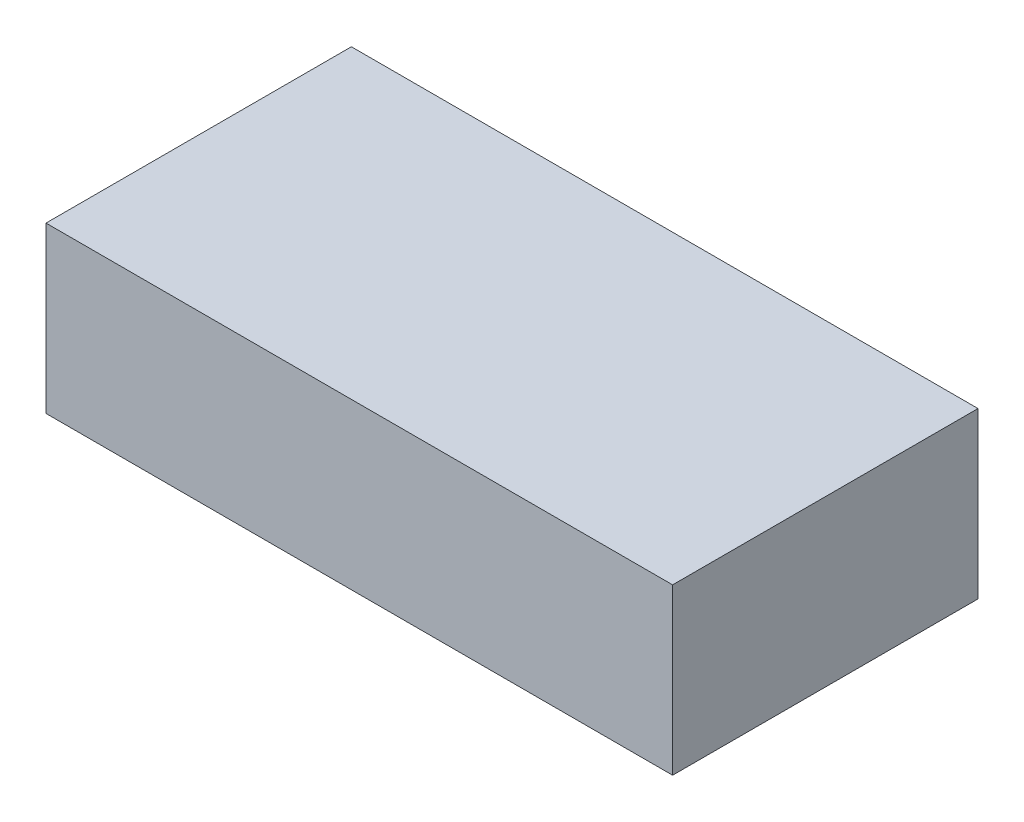
ISO-10303-21;
HEADER;
FILE_DESCRIPTION(('STEP AP214'),'2;1');
FILE_NAME('part.step','',(''),(''),'','','');
FILE_SCHEMA(('AUTOMOTIVE_DESIGN { 1 0 10303 214 1 1 1 1 }'));
ENDSEC;
DATA;
#1=APPLICATION_CONTEXT('core data for automotive mechanical design processes');
#2=APPLICATION_PROTOCOL_DEFINITION('international standard','automotive_design',2000,#1);
#3=PRODUCT_CONTEXT('',#1,'mechanical');
#4=PRODUCT('Part','Part','',(#3));
#5=PRODUCT_RELATED_PRODUCT_CATEGORY('part','',(#4));
#6=PRODUCT_DEFINITION_FORMATION('','',#4);
#7=PRODUCT_DEFINITION_CONTEXT('part definition',#1,'design');
#8=PRODUCT_DEFINITION('design','',#6,#7);
#9=PRODUCT_DEFINITION_SHAPE('','',#8);
#10=(LENGTH_UNIT() NAMED_UNIT(*) SI_UNIT(.MILLI.,.METRE.));
#11=(NAMED_UNIT(*) PLANE_ANGLE_UNIT() SI_UNIT($,.RADIAN.));
#12=(NAMED_UNIT(*) SI_UNIT($,.STERADIAN.) SOLID_ANGLE_UNIT());
#13=UNCERTAINTY_MEASURE_WITH_UNIT(LENGTH_MEASURE(1.E-05),#10,'distance_accuracy_value','');
#14=(GEOMETRIC_REPRESENTATION_CONTEXT(3) GLOBAL_UNCERTAINTY_ASSIGNED_CONTEXT((#13)) GLOBAL_UNIT_ASSIGNED_CONTEXT((#10,
#11,#12)) REPRESENTATION_CONTEXT('',''));
#15=CARTESIAN_POINT('',(0.,0.,0.));
#16=DIRECTION('',(0.,0.,1.));
#17=DIRECTION('',(1.,0.,0.));
#18=AXIS2_PLACEMENT_3D('',#15,#16,#17);
#19=CARTESIAN_POINT('',(0.,63.5,0.));
#20=DIRECTION('',(1.,0.,0.));
#21=DIRECTION('',(0.,0.,-1.));
#22=AXIS2_PLACEMENT_3D('',#19,#20,#21);
#23=PLANE('',#22);
#24=DIRECTION('',(0.,0.,1.));
#25=VECTOR('',#24,1.);
#26=CARTESIAN_POINT('',(0.,0.,0.));
#27=LINE('',#26,#25);
#28=CARTESIAN_POINT('',(0.,0.,-117.602));
#29=VERTEX_POINT('',#28);
#30=CARTESIAN_POINT('',(0.,0.,0.));
#31=VERTEX_POINT('',#30);
#32=EDGE_CURVE('E104',#29,#31,#27,.T.);
#33=ORIENTED_EDGE('',*,*,#32,.T.);
#34=DIRECTION('',(0.,-1.,0.));
#35=VECTOR('',#34,1.);
#36=CARTESIAN_POINT('',(0.,63.5,0.));
#37=LINE('',#36,#35);
#38=CARTESIAN_POINT('',(0.,63.5,0.));
#39=VERTEX_POINT('',#38);
#40=EDGE_CURVE('E11',#39,#31,#37,.T.);
#41=ORIENTED_EDGE('',*,*,#40,.F.);
#42=DIRECTION('',(0.,0.,1.));
#43=VECTOR('',#42,1.);
#44=CARTESIAN_POINT('',(0.,63.5,0.));
#45=LINE('',#44,#43);
#46=CARTESIAN_POINT('',(0.,63.5,-117.602));
#47=VERTEX_POINT('',#46);
#48=EDGE_CURVE('E92',#47,#39,#45,.T.);
#49=ORIENTED_EDGE('',*,*,#48,.F.);
#50=DIRECTION('',(0.,-1.,0.));
#51=VECTOR('',#50,1.);
#52=CARTESIAN_POINT('',(0.,63.5,-117.602));
#53=LINE('',#52,#51);
#54=EDGE_CURVE('E100',#47,#29,#53,.T.);
#55=ORIENTED_EDGE('',*,*,#54,.T.);
#56=EDGE_LOOP('',(#33,#41,#49,#55));
#57=FACE_BOUND('',#56,.T.);
#58=ADVANCED_FACE('F41',(#57),#23,.F.);
#59=CARTESIAN_POINT('',(0.,63.5,0.));
#60=DIRECTION('',(0.,0.,-1.));
#61=DIRECTION('',(-1.,0.,0.));
#62=AXIS2_PLACEMENT_3D('',#59,#60,#61);
#63=PLANE('',#62);
#64=DIRECTION('',(1.,0.,0.));
#65=VECTOR('',#64,1.);
#66=CARTESIAN_POINT('',(0.,0.,0.));
#67=LINE('',#66,#65);
#68=CARTESIAN_POINT('',(241.3,0.,0.));
#69=VERTEX_POINT('',#68);
#70=EDGE_CURVE('E96',#31,#69,#67,.T.);
#71=ORIENTED_EDGE('',*,*,#70,.T.);
#72=DIRECTION('',(0.,-1.,0.));
#73=VECTOR('',#72,1.);
#74=CARTESIAN_POINT('',(241.3,63.5,0.));
#75=LINE('',#74,#73);
#76=CARTESIAN_POINT('',(241.3,63.5,0.));
#77=VERTEX_POINT('',#76);
#78=EDGE_CURVE('E49',#77,#69,#75,.T.);
#79=ORIENTED_EDGE('',*,*,#78,.F.);
#80=DIRECTION('',(1.,0.,0.));
#81=VECTOR('',#80,1.);
#82=CARTESIAN_POINT('',(0.,63.5,0.));
#83=LINE('',#82,#81);
#84=EDGE_CURVE('E87',#39,#77,#83,.T.);
#85=ORIENTED_EDGE('',*,*,#84,.F.);
#86=ORIENTED_EDGE('',*,*,#40,.T.);
#87=EDGE_LOOP('',(#71,#79,#85,#86));
#88=FACE_BOUND('',#87,.T.);
#89=ADVANCED_FACE('F95',(#88),#63,.F.);
#90=CARTESIAN_POINT('',(241.3,63.5,0.));
#91=DIRECTION('',(-1.,0.,0.));
#92=DIRECTION('',(0.,0.,1.));
#93=AXIS2_PLACEMENT_3D('',#90,#91,#92);
#94=PLANE('',#93);
#95=DIRECTION('',(0.,0.,-1.));
#96=VECTOR('',#95,1.);
#97=CARTESIAN_POINT('',(241.3,0.,0.));
#98=LINE('',#97,#96);
#99=CARTESIAN_POINT('',(241.3,0.,-117.602));
#100=VERTEX_POINT('',#99);
#101=EDGE_CURVE('E74',#69,#100,#98,.T.);
#102=ORIENTED_EDGE('',*,*,#101,.T.);
#103=DIRECTION('',(0.,-1.,0.));
#104=VECTOR('',#103,1.);
#105=CARTESIAN_POINT('',(241.3,63.5,-117.602));
#106=LINE('',#105,#104);
#107=CARTESIAN_POINT('',(241.3,63.5,-117.602));
#108=VERTEX_POINT('',#107);
#109=EDGE_CURVE('E97',#108,#100,#106,.T.);
#110=ORIENTED_EDGE('',*,*,#109,.F.);
#111=DIRECTION('',(0.,0.,-1.));
#112=VECTOR('',#111,1.);
#113=CARTESIAN_POINT('',(241.3,63.5,0.));
#114=LINE('',#113,#112);
#115=EDGE_CURVE('E90',#77,#108,#114,.T.);
#116=ORIENTED_EDGE('',*,*,#115,.F.);
#117=ORIENTED_EDGE('',*,*,#78,.T.);
#118=EDGE_LOOP('',(#102,#110,#116,#117));
#119=FACE_BOUND('',#118,.T.);
#120=ADVANCED_FACE('F98',(#119),#94,.F.);
#121=CARTESIAN_POINT('',(0.,63.5,-117.602));
#122=DIRECTION('',(0.,0.,1.));
#123=DIRECTION('',(1.,0.,0.));
#124=AXIS2_PLACEMENT_3D('',#121,#122,#123);
#125=PLANE('',#124);
#126=DIRECTION('',(-1.,0.,0.));
#127=VECTOR('',#126,1.);
#128=CARTESIAN_POINT('',(0.,0.,-117.602));
#129=LINE('',#128,#127);
#130=EDGE_CURVE('E80',#100,#29,#129,.T.);
#131=ORIENTED_EDGE('',*,*,#130,.T.);
#132=ORIENTED_EDGE('',*,*,#54,.F.);
#133=DIRECTION('',(-1.,0.,0.));
#134=VECTOR('',#133,1.);
#135=CARTESIAN_POINT('',(0.,63.5,-117.602));
#136=LINE('',#135,#134);
#137=EDGE_CURVE('E57',#108,#47,#136,.T.);
#138=ORIENTED_EDGE('',*,*,#137,.F.);
#139=ORIENTED_EDGE('',*,*,#109,.T.);
#140=EDGE_LOOP('',(#131,#132,#138,#139));
#141=FACE_BOUND('',#140,.T.);
#142=ADVANCED_FACE('F111',(#141),#125,.F.);
#143=CARTESIAN_POINT('',(0.,63.5,0.));
#144=DIRECTION('',(0.,-1.,0.));
#145=DIRECTION('',(0.,0.,-1.));
#146=AXIS2_PLACEMENT_3D('',#143,#144,#145);
#147=PLANE('',#146);
#148=ORIENTED_EDGE('',*,*,#48,.T.);
#149=ORIENTED_EDGE('',*,*,#84,.T.);
#150=ORIENTED_EDGE('',*,*,#115,.T.);
#151=ORIENTED_EDGE('',*,*,#137,.T.);
#152=EDGE_LOOP('',(#148,#149,#150,#151));
#153=FACE_BOUND('',#152,.T.);
#154=ADVANCED_FACE('F88',(#153),#147,.F.);
#155=CARTESIAN_POINT('',(0.,0.,0.));
#156=DIRECTION('',(0.,-1.,0.));
#157=DIRECTION('',(0.,0.,-1.));
#158=AXIS2_PLACEMENT_3D('',#155,#156,#157);
#159=PLANE('',#158);
#160=ORIENTED_EDGE('',*,*,#32,.F.);
#161=ORIENTED_EDGE('',*,*,#130,.F.);
#162=ORIENTED_EDGE('',*,*,#101,.F.);
#163=ORIENTED_EDGE('',*,*,#70,.F.);
#164=EDGE_LOOP('',(#160,#161,#162,#163));
#165=FACE_BOUND('',#164,.T.);
#166=ADVANCED_FACE('F114',(#165),#159,.T.);
#167=CLOSED_SHELL('',(#58,#89,#120,#142,#154,#166));
#168=MANIFOLD_SOLID_BREP('B2',#167);
#169=ADVANCED_BREP_SHAPE_REPRESENTATION('',(#18,#168),#14);
#170=SHAPE_DEFINITION_REPRESENTATION(#9,#169);
ENDSEC;
END-ISO-10303-21;
